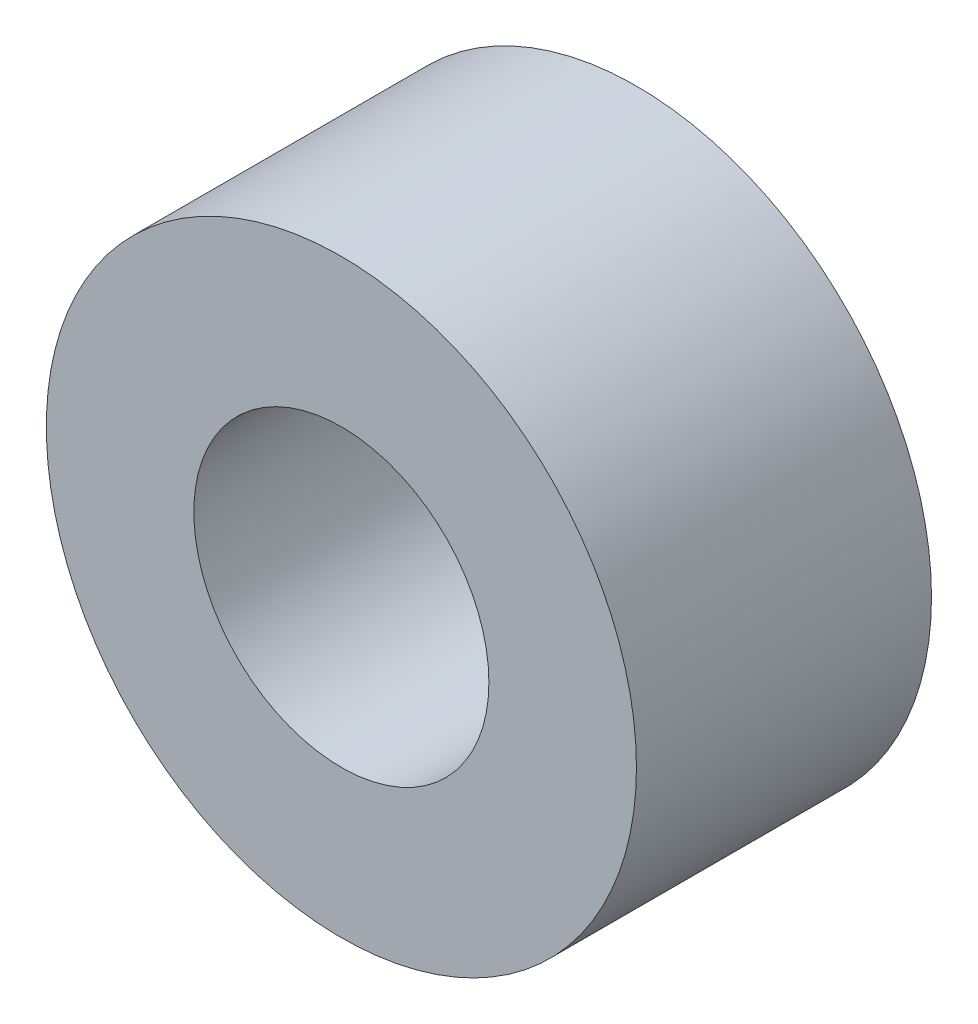
ISO-10303-21;
HEADER;
FILE_DESCRIPTION(('STEP AP214'),'2;1');
FILE_NAME('part.step','',(''),(''),'','','');
FILE_SCHEMA(('AUTOMOTIVE_DESIGN { 1 0 10303 214 1 1 1 1 }'));
ENDSEC;
DATA;
#1=APPLICATION_CONTEXT('core data for automotive mechanical design processes');
#2=APPLICATION_PROTOCOL_DEFINITION('international standard','automotive_design',2000,#1);
#3=PRODUCT_CONTEXT('',#1,'mechanical');
#4=PRODUCT('Part','Part','',(#3));
#5=PRODUCT_RELATED_PRODUCT_CATEGORY('part','',(#4));
#6=PRODUCT_DEFINITION_FORMATION('','',#4);
#7=PRODUCT_DEFINITION_CONTEXT('part definition',#1,'design');
#8=PRODUCT_DEFINITION('design','',#6,#7);
#9=PRODUCT_DEFINITION_SHAPE('','',#8);
#10=(LENGTH_UNIT() NAMED_UNIT(*) SI_UNIT(.MILLI.,.METRE.));
#11=(NAMED_UNIT(*) PLANE_ANGLE_UNIT() SI_UNIT($,.RADIAN.));
#12=(NAMED_UNIT(*) SI_UNIT($,.STERADIAN.) SOLID_ANGLE_UNIT());
#13=UNCERTAINTY_MEASURE_WITH_UNIT(LENGTH_MEASURE(1.E-05),#10,'distance_accuracy_value','');
#14=(GEOMETRIC_REPRESENTATION_CONTEXT(3) GLOBAL_UNCERTAINTY_ASSIGNED_CONTEXT((#13)) GLOBAL_UNIT_ASSIGNED_CONTEXT((#10,
#11,#12)) REPRESENTATION_CONTEXT('',''));
#15=CARTESIAN_POINT('',(0.,0.,0.));
#16=DIRECTION('',(0.,0.,1.));
#17=DIRECTION('',(1.,0.,0.));
#18=AXIS2_PLACEMENT_3D('',#15,#16,#17);
#19=CARTESIAN_POINT('',(0.,0.,6.35));
#20=DIRECTION('',(0.,0.,1.));
#21=DIRECTION('',(1.,0.,0.));
#22=AXIS2_PLACEMENT_3D('',#19,#20,#21);
#23=PLANE('',#22);
#24=CARTESIAN_POINT('',(0.,0.,6.35));
#25=DIRECTION('',(0.,0.,1.));
#26=DIRECTION('',(1.,0.,0.));
#27=AXIS2_PLACEMENT_3D('',#24,#25,#26);
#28=CIRCLE('',#27,12.7);
#29=CARTESIAN_POINT('',(12.7,0.,6.35));
#30=VERTEX_POINT('',#29);
#31=EDGE_CURVE('E10',#30,#30,#28,.T.);
#32=ORIENTED_EDGE('',*,*,#31,.T.);
#33=EDGE_LOOP('',(#32));
#34=FACE_BOUND('',#33,.T.);
#35=CARTESIAN_POINT('',(0.,0.,6.35));
#36=DIRECTION('',(0.,0.,1.));
#37=DIRECTION('',(1.,0.,0.));
#38=AXIS2_PLACEMENT_3D('',#35,#36,#37);
#39=CIRCLE('',#38,6.35);
#40=CARTESIAN_POINT('',(6.35,0.,6.35));
#41=VERTEX_POINT('',#40);
#42=EDGE_CURVE('E54',#41,#41,#39,.T.);
#43=ORIENTED_EDGE('',*,*,#42,.F.);
#44=EDGE_LOOP('',(#43));
#45=FACE_BOUND('',#44,.T.);
#46=ADVANCED_FACE('F41',(#34,#45),#23,.T.);
#47=CARTESIAN_POINT('',(0.,0.,-6.35));
#48=DIRECTION('',(0.,0.,1.));
#49=DIRECTION('',(1.,0.,0.));
#50=AXIS2_PLACEMENT_3D('',#47,#48,#49);
#51=PLANE('',#50);
#52=CARTESIAN_POINT('',(0.,0.,-6.35));
#53=DIRECTION('',(0.,0.,1.));
#54=DIRECTION('',(1.,0.,0.));
#55=AXIS2_PLACEMENT_3D('',#52,#53,#54);
#56=CIRCLE('',#55,12.7);
#57=CARTESIAN_POINT('',(12.7,0.,-6.35));
#58=VERTEX_POINT('',#57);
#59=EDGE_CURVE('E45',#58,#58,#56,.T.);
#60=ORIENTED_EDGE('',*,*,#59,.F.);
#61=EDGE_LOOP('',(#60));
#62=FACE_BOUND('',#61,.T.);
#63=CARTESIAN_POINT('',(0.,0.,-6.35));
#64=DIRECTION('',(0.,0.,1.));
#65=DIRECTION('',(1.,0.,0.));
#66=AXIS2_PLACEMENT_3D('',#63,#64,#65);
#67=CIRCLE('',#66,6.35);
#68=CARTESIAN_POINT('',(6.35,0.,-6.35));
#69=VERTEX_POINT('',#68);
#70=EDGE_CURVE('E56',#69,#69,#67,.T.);
#71=ORIENTED_EDGE('',*,*,#70,.T.);
#72=EDGE_LOOP('',(#71));
#73=FACE_BOUND('',#72,.T.);
#74=ADVANCED_FACE('F68',(#62,#73),#51,.F.);
#75=CARTESIAN_POINT('',(0.,0.,6.35));
#76=DIRECTION('',(0.,0.,-1.));
#77=DIRECTION('',(-1.,0.,0.));
#78=AXIS2_PLACEMENT_3D('',#75,#76,#77);
#79=CYLINDRICAL_SURFACE('',#78,12.7);
#80=ORIENTED_EDGE('',*,*,#31,.F.);
#81=EDGE_LOOP('',(#80));
#82=FACE_BOUND('',#81,.T.);
#83=ORIENTED_EDGE('',*,*,#59,.T.);
#84=EDGE_LOOP('',(#83));
#85=FACE_BOUND('',#84,.T.);
#86=ADVANCED_FACE('F43',(#82,#85),#79,.T.);
#87=CARTESIAN_POINT('',(0.,0.,6.35));
#88=DIRECTION('',(0.,0.,-1.));
#89=DIRECTION('',(-1.,0.,0.));
#90=AXIS2_PLACEMENT_3D('',#87,#88,#89);
#91=CYLINDRICAL_SURFACE('',#90,6.35);
#92=ORIENTED_EDGE('',*,*,#42,.T.);
#93=EDGE_LOOP('',(#92));
#94=FACE_BOUND('',#93,.T.);
#95=ORIENTED_EDGE('',*,*,#70,.F.);
#96=EDGE_LOOP('',(#95));
#97=FACE_BOUND('',#96,.T.);
#98=ADVANCED_FACE('F64',(#94,#97),#91,.F.);
#99=CLOSED_SHELL('',(#46,#74,#86,#98));
#100=MANIFOLD_SOLID_BREP('B2',#99);
#101=ADVANCED_BREP_SHAPE_REPRESENTATION('',(#18,#100),#14);
#102=SHAPE_DEFINITION_REPRESENTATION(#9,#101);
ENDSEC;
END-ISO-10303-21;
